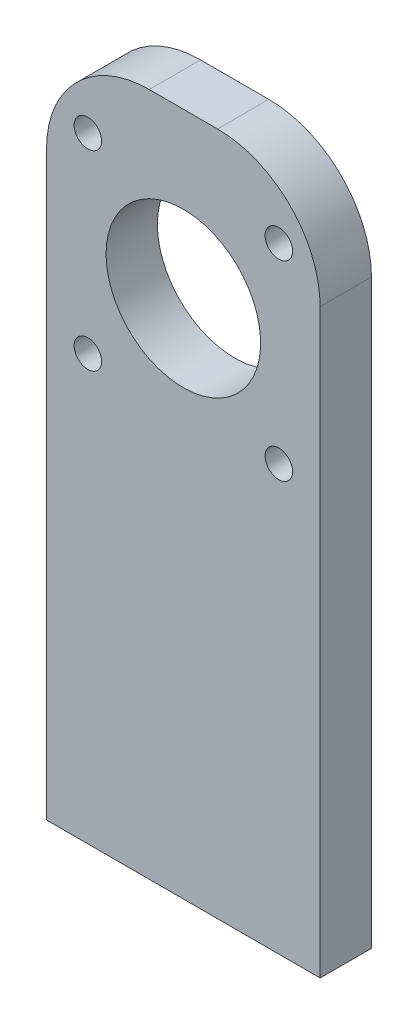
ISO-10303-21;
HEADER;
FILE_DESCRIPTION(('STEP AP214'),'2;1');
FILE_NAME('part.step','',(''),(''),'','','');
FILE_SCHEMA(('AUTOMOTIVE_DESIGN { 1 0 10303 214 1 1 1 1 }'));
ENDSEC;
DATA;
#1=APPLICATION_CONTEXT('core data for automotive mechanical design processes');
#2=APPLICATION_PROTOCOL_DEFINITION('international standard','automotive_design',2000,#1);
#3=PRODUCT_CONTEXT('',#1,'mechanical');
#4=PRODUCT('Part','Part','',(#3));
#5=PRODUCT_RELATED_PRODUCT_CATEGORY('part','',(#4));
#6=PRODUCT_DEFINITION_FORMATION('','',#4);
#7=PRODUCT_DEFINITION_CONTEXT('part definition',#1,'design');
#8=PRODUCT_DEFINITION('design','',#6,#7);
#9=PRODUCT_DEFINITION_SHAPE('','',#8);
#10=(LENGTH_UNIT() NAMED_UNIT(*) SI_UNIT(.MILLI.,.METRE.));
#11=(NAMED_UNIT(*) PLANE_ANGLE_UNIT() SI_UNIT($,.RADIAN.));
#12=(NAMED_UNIT(*) SI_UNIT($,.STERADIAN.) SOLID_ANGLE_UNIT());
#13=UNCERTAINTY_MEASURE_WITH_UNIT(LENGTH_MEASURE(1.E-05),#10,'distance_accuracy_value','');
#14=(GEOMETRIC_REPRESENTATION_CONTEXT(3) GLOBAL_UNCERTAINTY_ASSIGNED_CONTEXT((#13)) GLOBAL_UNIT_ASSIGNED_CONTEXT((#10,
#11,#12)) REPRESENTATION_CONTEXT('',''));
#15=CARTESIAN_POINT('',(0.,0.,0.));
#16=DIRECTION('',(0.,0.,1.));
#17=DIRECTION('',(1.,0.,0.));
#18=AXIS2_PLACEMENT_3D('',#15,#16,#17);
#19=CARTESIAN_POINT('',(0.,0.,9.525));
#20=DIRECTION('',(0.,0.,-1.));
#21=DIRECTION('',(-1.,0.,0.));
#22=AXIS2_PLACEMENT_3D('',#19,#20,#21);
#23=PLANE('',#22);
#24=DIRECTION('',(-1.,0.,0.));
#25=VECTOR('',#24,1.);
#26=CARTESIAN_POINT('',(0.,127.,9.525));
#27=LINE('',#26,#25);
#28=CARTESIAN_POINT('',(31.75,127.,9.525));
#29=VERTEX_POINT('',#28);
#30=CARTESIAN_POINT('',(19.05,127.,9.525));
#31=VERTEX_POINT('',#30);
#32=EDGE_CURVE('E127',#29,#31,#27,.T.);
#33=ORIENTED_EDGE('',*,*,#32,.T.);
#34=CARTESIAN_POINT('',(19.05,107.95,9.525));
#35=DIRECTION('',(0.,0.,-1.));
#36=DIRECTION('',(-1.,0.,0.));
#37=AXIS2_PLACEMENT_3D('',#34,#35,#36);
#38=CIRCLE('',#37,19.05);
#39=CARTESIAN_POINT('',(0.,107.95,9.525));
#40=VERTEX_POINT('',#39);
#41=EDGE_CURVE('E11',#31,#40,#38,.F.);
#42=ORIENTED_EDGE('',*,*,#41,.T.);
#43=DIRECTION('',(0.,-1.,0.));
#44=VECTOR('',#43,1.);
#45=CARTESIAN_POINT('',(0.,0.,9.525));
#46=LINE('',#45,#44);
#47=CARTESIAN_POINT('',(0.,0.,9.525));
#48=VERTEX_POINT('',#47);
#49=EDGE_CURVE('E92',#40,#48,#46,.T.);
#50=ORIENTED_EDGE('',*,*,#49,.T.);
#51=DIRECTION('',(1.,0.,0.));
#52=VECTOR('',#51,1.);
#53=CARTESIAN_POINT('',(0.,0.,9.525));
#54=LINE('',#53,#52);
#55=CARTESIAN_POINT('',(50.8,0.,9.525));
#56=VERTEX_POINT('',#55);
#57=EDGE_CURVE('E96',#48,#56,#54,.T.);
#58=ORIENTED_EDGE('',*,*,#57,.T.);
#59=DIRECTION('',(0.,1.,0.));
#60=VECTOR('',#59,1.);
#61=CARTESIAN_POINT('',(50.8,0.,9.525));
#62=LINE('',#61,#60);
#63=CARTESIAN_POINT('',(50.8,107.95,9.525));
#64=VERTEX_POINT('',#63);
#65=EDGE_CURVE('E114',#56,#64,#62,.T.);
#66=ORIENTED_EDGE('',*,*,#65,.T.);
#67=CARTESIAN_POINT('',(31.75,107.95,9.525));
#68=DIRECTION('',(0.,0.,-1.));
#69=DIRECTION('',(-1.,0.,0.));
#70=AXIS2_PLACEMENT_3D('',#67,#68,#69);
#71=CIRCLE('',#70,19.05);
#72=EDGE_CURVE('E136',#64,#29,#71,.F.);
#73=ORIENTED_EDGE('',*,*,#72,.T.);
#74=EDGE_LOOP('',(#33,#42,#50,#58,#66,#73));
#75=FACE_BOUND('',#74,.T.);
#76=CARTESIAN_POINT('',(43.1292,114.3,9.525));
#77=DIRECTION('',(0.,0.,1.));
#78=DIRECTION('',(1.,0.,0.));
#79=AXIS2_PLACEMENT_3D('',#76,#77,#78);
#80=CIRCLE('',#79,2.5527);
#81=CARTESIAN_POINT('',(40.5765,114.3,9.525));
#82=VERTEX_POINT('',#81);
#83=EDGE_CURVE('E150',#82,#82,#80,.T.);
#84=ORIENTED_EDGE('',*,*,#83,.F.);
#85=EDGE_LOOP('',(#84));
#86=FACE_BOUND('',#85,.T.);
#87=CARTESIAN_POINT('',(25.4,96.5708,9.525));
#88=DIRECTION('',(0.,0.,1.));
#89=DIRECTION('',(1.,0.,0.));
#90=AXIS2_PLACEMENT_3D('',#87,#88,#89);
#91=CIRCLE('',#90,14.351);
#92=CARTESIAN_POINT('',(11.049,96.5708,9.525));
#93=VERTEX_POINT('',#92);
#94=EDGE_CURVE('E314',#93,#93,#91,.T.);
#95=ORIENTED_EDGE('',*,*,#94,.F.);
#96=EDGE_LOOP('',(#95));
#97=FACE_BOUND('',#96,.T.);
#98=CARTESIAN_POINT('',(7.67079999999998,114.3,9.525));
#99=DIRECTION('',(0.,0.,1.));
#100=DIRECTION('',(1.,0.,0.));
#101=AXIS2_PLACEMENT_3D('',#98,#99,#100);
#102=CIRCLE('',#101,2.5527);
#103=CARTESIAN_POINT('',(5.11809999999998,114.3,9.525));
#104=VERTEX_POINT('',#103);
#105=EDGE_CURVE('E306',#104,#104,#102,.T.);
#106=ORIENTED_EDGE('',*,*,#105,.F.);
#107=EDGE_LOOP('',(#106));
#108=FACE_BOUND('',#107,.T.);
#109=CARTESIAN_POINT('',(7.67079999999998,78.8416,9.525));
#110=DIRECTION('',(0.,0.,1.));
#111=DIRECTION('',(1.,0.,0.));
#112=AXIS2_PLACEMENT_3D('',#109,#110,#111);
#113=CIRCLE('',#112,2.5527);
#114=CARTESIAN_POINT('',(5.11809999999998,78.8416,9.525));
#115=VERTEX_POINT('',#114);
#116=EDGE_CURVE('E298',#115,#115,#113,.T.);
#117=ORIENTED_EDGE('',*,*,#116,.F.);
#118=EDGE_LOOP('',(#117));
#119=FACE_BOUND('',#118,.T.);
#120=CARTESIAN_POINT('',(43.1292,78.8416,9.525));
#121=DIRECTION('',(0.,0.,1.));
#122=DIRECTION('',(1.,0.,0.));
#123=AXIS2_PLACEMENT_3D('',#120,#121,#122);
#124=CIRCLE('',#123,2.5527);
#125=CARTESIAN_POINT('',(40.5765,78.8416,9.525));
#126=VERTEX_POINT('',#125);
#127=EDGE_CURVE('E287',#126,#126,#124,.T.);
#128=ORIENTED_EDGE('',*,*,#127,.F.);
#129=EDGE_LOOP('',(#128));
#130=FACE_BOUND('',#129,.T.);
#131=ADVANCED_FACE('F39',(#75,#86,#97,#108,#119,#130),#23,.F.);
#132=CARTESIAN_POINT('',(0.,0.,0.));
#133=DIRECTION('',(0.,0.,-1.));
#134=DIRECTION('',(-1.,0.,0.));
#135=AXIS2_PLACEMENT_3D('',#132,#133,#134);
#136=PLANE('',#135);
#137=CARTESIAN_POINT('',(7.67079999999998,78.8416,0.));
#138=DIRECTION('',(0.,0.,1.));
#139=DIRECTION('',(1.,0.,0.));
#140=AXIS2_PLACEMENT_3D('',#137,#138,#139);
#141=CIRCLE('',#140,2.5527);
#142=CARTESIAN_POINT('',(5.11809999999998,78.8416,0.));
#143=VERTEX_POINT('',#142);
#144=EDGE_CURVE('E295',#143,#143,#141,.T.);
#145=ORIENTED_EDGE('',*,*,#144,.T.);
#146=EDGE_LOOP('',(#145));
#147=FACE_BOUND('',#146,.T.);
#148=CARTESIAN_POINT('',(25.4,96.5708,0.));
#149=DIRECTION('',(0.,0.,1.));
#150=DIRECTION('',(1.,0.,0.));
#151=AXIS2_PLACEMENT_3D('',#148,#149,#150);
#152=CIRCLE('',#151,14.351);
#153=CARTESIAN_POINT('',(11.049,96.5708,0.));
#154=VERTEX_POINT('',#153);
#155=EDGE_CURVE('E310',#154,#154,#152,.T.);
#156=ORIENTED_EDGE('',*,*,#155,.T.);
#157=EDGE_LOOP('',(#156));
#158=FACE_BOUND('',#157,.T.);
#159=DIRECTION('',(0.,-1.,0.));
#160=VECTOR('',#159,1.);
#161=CARTESIAN_POINT('',(0.,0.,0.));
#162=LINE('',#161,#160);
#163=CARTESIAN_POINT('',(0.,107.95,0.));
#164=VERTEX_POINT('',#163);
#165=CARTESIAN_POINT('',(0.,0.,0.));
#166=VERTEX_POINT('',#165);
#167=EDGE_CURVE('E117',#164,#166,#162,.T.);
#168=ORIENTED_EDGE('',*,*,#167,.F.);
#169=CARTESIAN_POINT('',(19.05,107.95,0.));
#170=DIRECTION('',(0.,0.,-1.));
#171=DIRECTION('',(-1.,0.,0.));
#172=AXIS2_PLACEMENT_3D('',#169,#170,#171);
#173=CIRCLE('',#172,19.05);
#174=CARTESIAN_POINT('',(19.05,127.,0.));
#175=VERTEX_POINT('',#174);
#176=EDGE_CURVE('E62',#164,#175,#173,.T.);
#177=ORIENTED_EDGE('',*,*,#176,.T.);
#178=DIRECTION('',(-1.,0.,0.));
#179=VECTOR('',#178,1.);
#180=CARTESIAN_POINT('',(0.,127.,0.));
#181=LINE('',#180,#179);
#182=CARTESIAN_POINT('',(31.75,127.,0.));
#183=VERTEX_POINT('',#182);
#184=EDGE_CURVE('E104',#183,#175,#181,.T.);
#185=ORIENTED_EDGE('',*,*,#184,.F.);
#186=CARTESIAN_POINT('',(31.75,107.95,0.));
#187=DIRECTION('',(0.,0.,-1.));
#188=DIRECTION('',(-1.,0.,0.));
#189=AXIS2_PLACEMENT_3D('',#186,#187,#188);
#190=CIRCLE('',#189,19.05);
#191=CARTESIAN_POINT('',(50.8,107.95,0.));
#192=VERTEX_POINT('',#191);
#193=EDGE_CURVE('E125',#183,#192,#190,.T.);
#194=ORIENTED_EDGE('',*,*,#193,.T.);
#195=DIRECTION('',(0.,1.,0.));
#196=VECTOR('',#195,1.);
#197=CARTESIAN_POINT('',(50.8,0.,0.));
#198=LINE('',#197,#196);
#199=CARTESIAN_POINT('',(50.8,0.,0.));
#200=VERTEX_POINT('',#199);
#201=EDGE_CURVE('E154',#200,#192,#198,.T.);
#202=ORIENTED_EDGE('',*,*,#201,.F.);
#203=DIRECTION('',(1.,0.,0.));
#204=VECTOR('',#203,1.);
#205=CARTESIAN_POINT('',(0.,0.,0.));
#206=LINE('',#205,#204);
#207=EDGE_CURVE('E148',#166,#200,#206,.T.);
#208=ORIENTED_EDGE('',*,*,#207,.F.);
#209=EDGE_LOOP('',(#168,#177,#185,#194,#202,#208));
#210=FACE_BOUND('',#209,.T.);
#211=CARTESIAN_POINT('',(43.1292,114.3,0.));
#212=DIRECTION('',(0.,0.,1.));
#213=DIRECTION('',(1.,0.,0.));
#214=AXIS2_PLACEMENT_3D('',#211,#212,#213);
#215=CIRCLE('',#214,2.5527);
#216=CARTESIAN_POINT('',(40.5765,114.3,0.));
#217=VERTEX_POINT('',#216);
#218=EDGE_CURVE('E157',#217,#217,#215,.T.);
#219=ORIENTED_EDGE('',*,*,#218,.T.);
#220=EDGE_LOOP('',(#219));
#221=FACE_BOUND('',#220,.T.);
#222=CARTESIAN_POINT('',(7.67079999999998,114.3,0.));
#223=DIRECTION('',(0.,0.,1.));
#224=DIRECTION('',(1.,0.,0.));
#225=AXIS2_PLACEMENT_3D('',#222,#223,#224);
#226=CIRCLE('',#225,2.5527);
#227=CARTESIAN_POINT('',(5.11809999999998,114.3,0.));
#228=VERTEX_POINT('',#227);
#229=EDGE_CURVE('E302',#228,#228,#226,.T.);
#230=ORIENTED_EDGE('',*,*,#229,.T.);
#231=EDGE_LOOP('',(#230));
#232=FACE_BOUND('',#231,.T.);
#233=CARTESIAN_POINT('',(43.1292,78.8416,0.));
#234=DIRECTION('',(0.,0.,1.));
#235=DIRECTION('',(1.,0.,0.));
#236=AXIS2_PLACEMENT_3D('',#233,#234,#235);
#237=CIRCLE('',#236,2.5527);
#238=CARTESIAN_POINT('',(40.5765,78.8416,0.));
#239=VERTEX_POINT('',#238);
#240=EDGE_CURVE('E290',#239,#239,#237,.T.);
#241=ORIENTED_EDGE('',*,*,#240,.T.);
#242=EDGE_LOOP('',(#241));
#243=FACE_BOUND('',#242,.T.);
#244=ADVANCED_FACE('F145',(#147,#158,#210,#221,#232,#243),#136,.T.);
#245=CARTESIAN_POINT('',(0.,0.,9.525));
#246=DIRECTION('',(1.,0.,0.));
#247=DIRECTION('',(0.,1.,0.));
#248=AXIS2_PLACEMENT_3D('',#245,#246,#247);
#249=PLANE('',#248);
#250=ORIENTED_EDGE('',*,*,#49,.F.);
#251=DIRECTION('',(0.,0.,-1.));
#252=VECTOR('',#251,1.);
#253=CARTESIAN_POINT('',(0.,107.95,9.525));
#254=LINE('',#253,#252);
#255=EDGE_CURVE('E139',#40,#164,#254,.T.);
#256=ORIENTED_EDGE('',*,*,#255,.T.);
#257=ORIENTED_EDGE('',*,*,#167,.T.);
#258=DIRECTION('',(0.,0.,-1.));
#259=VECTOR('',#258,1.);
#260=CARTESIAN_POINT('',(0.,0.,9.525));
#261=LINE('',#260,#259);
#262=EDGE_CURVE('E109',#48,#166,#261,.T.);
#263=ORIENTED_EDGE('',*,*,#262,.F.);
#264=EDGE_LOOP('',(#250,#256,#257,#263));
#265=FACE_BOUND('',#264,.T.);
#266=ADVANCED_FACE('F116',(#265),#249,.F.);
#267=CARTESIAN_POINT('',(0.,0.,9.525));
#268=DIRECTION('',(0.,1.,0.));
#269=DIRECTION('',(0.,0.,1.));
#270=AXIS2_PLACEMENT_3D('',#267,#268,#269);
#271=PLANE('',#270);
#272=ORIENTED_EDGE('',*,*,#207,.T.);
#273=DIRECTION('',(0.,0.,-1.));
#274=VECTOR('',#273,1.);
#275=CARTESIAN_POINT('',(50.8,0.,9.525));
#276=LINE('',#275,#274);
#277=EDGE_CURVE('E111',#56,#200,#276,.T.);
#278=ORIENTED_EDGE('',*,*,#277,.F.);
#279=ORIENTED_EDGE('',*,*,#57,.F.);
#280=ORIENTED_EDGE('',*,*,#262,.T.);
#281=EDGE_LOOP('',(#272,#278,#279,#280));
#282=FACE_BOUND('',#281,.T.);
#283=ADVANCED_FACE('F108',(#282),#271,.F.);
#284=CARTESIAN_POINT('',(50.8,0.,9.525));
#285=DIRECTION('',(-1.,0.,0.));
#286=DIRECTION('',(0.,-1.,0.));
#287=AXIS2_PLACEMENT_3D('',#284,#285,#286);
#288=PLANE('',#287);
#289=ORIENTED_EDGE('',*,*,#201,.T.);
#290=DIRECTION('',(0.,0.,-1.));
#291=VECTOR('',#290,1.);
#292=CARTESIAN_POINT('',(50.8,107.95,9.525));
#293=LINE('',#292,#291);
#294=EDGE_CURVE('E133',#192,#64,#293,.F.);
#295=ORIENTED_EDGE('',*,*,#294,.T.);
#296=ORIENTED_EDGE('',*,*,#65,.F.);
#297=ORIENTED_EDGE('',*,*,#277,.T.);
#298=EDGE_LOOP('',(#289,#295,#296,#297));
#299=FACE_BOUND('',#298,.T.);
#300=ADVANCED_FACE('F187',(#299),#288,.F.);
#301=CARTESIAN_POINT('',(0.,127.,9.525));
#302=DIRECTION('',(0.,-1.,0.));
#303=DIRECTION('',(0.,0.,-1.));
#304=AXIS2_PLACEMENT_3D('',#301,#302,#303);
#305=PLANE('',#304);
#306=ORIENTED_EDGE('',*,*,#184,.T.);
#307=DIRECTION('',(0.,0.,-1.));
#308=VECTOR('',#307,1.);
#309=CARTESIAN_POINT('',(19.05,127.,9.525));
#310=LINE('',#309,#308);
#311=EDGE_CURVE('E48',#175,#31,#310,.F.);
#312=ORIENTED_EDGE('',*,*,#311,.T.);
#313=ORIENTED_EDGE('',*,*,#32,.F.);
#314=DIRECTION('',(0.,0.,-1.));
#315=VECTOR('',#314,1.);
#316=CARTESIAN_POINT('',(31.75,127.,9.525));
#317=LINE('',#316,#315);
#318=EDGE_CURVE('E120',#29,#183,#317,.T.);
#319=ORIENTED_EDGE('',*,*,#318,.T.);
#320=EDGE_LOOP('',(#306,#312,#313,#319));
#321=FACE_BOUND('',#320,.T.);
#322=ADVANCED_FACE('F165',(#321),#305,.F.);
#323=CARTESIAN_POINT('',(43.1292,114.3,9.525));
#324=DIRECTION('',(0.,0.,-1.));
#325=DIRECTION('',(-1.,0.,0.));
#326=AXIS2_PLACEMENT_3D('',#323,#324,#325);
#327=CYLINDRICAL_SURFACE('',#326,2.5527);
#328=CARTESIAN_POINT('',(40.5765,114.3,9.525));
#329=CARTESIAN_POINT('',(40.5765,114.3,9.42578125));
#330=CARTESIAN_POINT('',(40.5765,114.3,9.3265625));
#331=CARTESIAN_POINT('',(40.5765,114.3,9.128125));
#332=CARTESIAN_POINT('',(40.5765,114.3,9.02890625));
#333=CARTESIAN_POINT('',(40.5765,114.3,8.83046875));
#334=CARTESIAN_POINT('',(40.5765,114.3,8.73125));
#335=CARTESIAN_POINT('',(40.5765,114.3,8.5328125));
#336=CARTESIAN_POINT('',(40.5765,114.3,8.43359375));
#337=CARTESIAN_POINT('',(40.5765,114.3,8.23515625));
#338=CARTESIAN_POINT('',(40.5765,114.3,8.1359375));
#339=CARTESIAN_POINT('',(40.5765,114.3,7.9375));
#340=CARTESIAN_POINT('',(40.5765,114.3,7.83828125));
#341=CARTESIAN_POINT('',(40.5765,114.3,7.63984375));
#342=CARTESIAN_POINT('',(40.5765,114.3,7.540625));
#343=CARTESIAN_POINT('',(40.5765,114.3,7.3421875));
#344=CARTESIAN_POINT('',(40.5765,114.3,7.24296875));
#345=CARTESIAN_POINT('',(40.5765,114.3,7.04453125));
#346=CARTESIAN_POINT('',(40.5765,114.3,6.9453125));
#347=CARTESIAN_POINT('',(40.5765,114.3,6.746875));
#348=CARTESIAN_POINT('',(40.5765,114.3,6.64765625));
#349=CARTESIAN_POINT('',(40.5765,114.3,6.44921875));
#350=CARTESIAN_POINT('',(40.5765,114.3,6.35));
#351=CARTESIAN_POINT('',(40.5765,114.3,6.1515625));
#352=CARTESIAN_POINT('',(40.5765,114.3,6.05234375));
#353=CARTESIAN_POINT('',(40.5765,114.3,5.85390625));
#354=CARTESIAN_POINT('',(40.5765,114.3,5.7546875));
#355=CARTESIAN_POINT('',(40.5765,114.3,5.55625));
#356=CARTESIAN_POINT('',(40.5765,114.3,5.45703125));
#357=CARTESIAN_POINT('',(40.5765,114.3,5.25859375));
#358=CARTESIAN_POINT('',(40.5765,114.3,5.159375));
#359=CARTESIAN_POINT('',(40.5765,114.3,4.9609375));
#360=CARTESIAN_POINT('',(40.5765,114.3,4.86171875));
#361=CARTESIAN_POINT('',(40.5765,114.3,4.66328125));
#362=CARTESIAN_POINT('',(40.5765,114.3,4.5640625));
#363=CARTESIAN_POINT('',(40.5765,114.3,4.365625));
#364=CARTESIAN_POINT('',(40.5765,114.3,4.26640625));
#365=CARTESIAN_POINT('',(40.5765,114.3,4.06796875));
#366=CARTESIAN_POINT('',(40.5765,114.3,3.96875));
#367=CARTESIAN_POINT('',(40.5765,114.3,3.7703125));
#368=CARTESIAN_POINT('',(40.5765,114.3,3.67109375));
#369=CARTESIAN_POINT('',(40.5765,114.3,3.47265625));
#370=CARTESIAN_POINT('',(40.5765,114.3,3.3734375));
#371=CARTESIAN_POINT('',(40.5765,114.3,3.175));
#372=CARTESIAN_POINT('',(40.5765,114.3,3.07578125));
#373=CARTESIAN_POINT('',(40.5765,114.3,2.87734375));
#374=CARTESIAN_POINT('',(40.5765,114.3,2.778125));
#375=CARTESIAN_POINT('',(40.5765,114.3,2.5796875));
#376=CARTESIAN_POINT('',(40.5765,114.3,2.48046875));
#377=CARTESIAN_POINT('',(40.5765,114.3,2.28203125));
#378=CARTESIAN_POINT('',(40.5765,114.3,2.1828125));
#379=CARTESIAN_POINT('',(40.5765,114.3,1.984375));
#380=CARTESIAN_POINT('',(40.5765,114.3,1.88515625));
#381=CARTESIAN_POINT('',(40.5765,114.3,1.68671875));
#382=CARTESIAN_POINT('',(40.5765,114.3,1.5875));
#383=CARTESIAN_POINT('',(40.5765,114.3,1.3890625));
#384=CARTESIAN_POINT('',(40.5765,114.3,1.28984375));
#385=CARTESIAN_POINT('',(40.5765,114.3,1.09140625));
#386=CARTESIAN_POINT('',(40.5765,114.3,0.992187500000001));
#387=CARTESIAN_POINT('',(40.5765,114.3,0.793750000000001));
#388=CARTESIAN_POINT('',(40.5765,114.3,0.69453125));
#389=CARTESIAN_POINT('',(40.5765,114.3,0.49609375));
#390=CARTESIAN_POINT('',(40.5765,114.3,0.396875));
#391=CARTESIAN_POINT('',(40.5765,114.3,0.1984375));
#392=CARTESIAN_POINT('',(40.5765,114.3,0.0992187500000001));
#393=CARTESIAN_POINT('',(40.5765,114.3,0.));
#394=B_SPLINE_CURVE_WITH_KNOTS('',3,(#328,#329,#330,#331,#332,#333,#334,#335,#336,#337,#338,
#339,#340,#341,#342,#343,#344,#345,#346,#347,#348,#349,#350,#351,#352,#353,#354,#355,#356,#357,
#358,#359,#360,#361,#362,#363,#364,#365,#366,#367,#368,#369,#370,#371,#372,#373,#374,#375,#376,
#377,#378,#379,#380,#381,#382,#383,#384,#385,#386,#387,#388,#389,#390,#391,#392,#393),
.UNSPECIFIED.,.F.,.F.,(4,2,2,2,2,2,2,2,2,2,2,2,2,2,2,2,2,2,2,2,2,2,2,2,2,2,2,2,2,2,2,2,4),(0.,
0.29765625,0.5953125,0.892968750000001,1.190625,1.48828125,1.7859375,2.08359375,2.38125,
2.67890625,2.9765625,3.27421875,3.571875,3.86953125,4.1671875,4.46484375,4.7625,5.06015625,
5.3578125,5.65546875,5.953125,6.25078125,6.5484375,6.84609375,7.14375,7.44140625,7.7390625,
8.03671875,8.334375,8.63203125,8.9296875,9.22734375,9.525),.UNSPECIFIED.);
#395=EDGE_CURVE('BSEAM182',#82,#217,#394,.T.);
#396=ORIENTED_EDGE('',*,*,#83,.T.);
#397=ORIENTED_EDGE('',*,*,#218,.F.);
#398=ORIENTED_EDGE('',*,*,#395,.T.);
#399=ORIENTED_EDGE('',*,*,#395,.F.);
#400=EDGE_LOOP('',(#396,#398,#397,#399));
#401=FACE_BOUND('',#400,.T.);
#402=ADVANCED_FACE('F182',(#401),#327,.F.);
#403=CARTESIAN_POINT('',(25.4,96.5708,9.525));
#404=DIRECTION('',(0.,0.,-1.));
#405=DIRECTION('',(-1.,0.,0.));
#406=AXIS2_PLACEMENT_3D('',#403,#404,#405);
#407=CYLINDRICAL_SURFACE('',#406,14.351);
#408=CARTESIAN_POINT('',(11.049,96.5708,9.525));
#409=CARTESIAN_POINT('',(11.049,96.5708,9.42578125));
#410=CARTESIAN_POINT('',(11.049,96.5708,9.3265625));
#411=CARTESIAN_POINT('',(11.049,96.5708,9.128125));
#412=CARTESIAN_POINT('',(11.049,96.5708,9.02890625));
#413=CARTESIAN_POINT('',(11.049,96.5708,8.83046875));
#414=CARTESIAN_POINT('',(11.049,96.5708,8.73125));
#415=CARTESIAN_POINT('',(11.049,96.5708,8.5328125));
#416=CARTESIAN_POINT('',(11.049,96.5708,8.43359375));
#417=CARTESIAN_POINT('',(11.049,96.5708,8.23515625));
#418=CARTESIAN_POINT('',(11.049,96.5708,8.1359375));
#419=CARTESIAN_POINT('',(11.049,96.5708,7.9375));
#420=CARTESIAN_POINT('',(11.049,96.5708,7.83828125));
#421=CARTESIAN_POINT('',(11.049,96.5708,7.63984375));
#422=CARTESIAN_POINT('',(11.049,96.5708,7.540625));
#423=CARTESIAN_POINT('',(11.049,96.5708,7.3421875));
#424=CARTESIAN_POINT('',(11.049,96.5708,7.24296875));
#425=CARTESIAN_POINT('',(11.049,96.5708,7.04453125));
#426=CARTESIAN_POINT('',(11.049,96.5708,6.9453125));
#427=CARTESIAN_POINT('',(11.049,96.5708,6.746875));
#428=CARTESIAN_POINT('',(11.049,96.5708,6.64765625));
#429=CARTESIAN_POINT('',(11.049,96.5708,6.44921875));
#430=CARTESIAN_POINT('',(11.049,96.5708,6.35));
#431=CARTESIAN_POINT('',(11.049,96.5708,6.1515625));
#432=CARTESIAN_POINT('',(11.049,96.5708,6.05234375));
#433=CARTESIAN_POINT('',(11.049,96.5708,5.85390625));
#434=CARTESIAN_POINT('',(11.049,96.5708,5.7546875));
#435=CARTESIAN_POINT('',(11.049,96.5708,5.55625));
#436=CARTESIAN_POINT('',(11.049,96.5708,5.45703125));
#437=CARTESIAN_POINT('',(11.049,96.5708,5.25859375));
#438=CARTESIAN_POINT('',(11.049,96.5708,5.159375));
#439=CARTESIAN_POINT('',(11.049,96.5708,4.9609375));
#440=CARTESIAN_POINT('',(11.049,96.5708,4.86171875));
#441=CARTESIAN_POINT('',(11.049,96.5708,4.66328125));
#442=CARTESIAN_POINT('',(11.049,96.5708,4.5640625));
#443=CARTESIAN_POINT('',(11.049,96.5708,4.365625));
#444=CARTESIAN_POINT('',(11.049,96.5708,4.26640625));
#445=CARTESIAN_POINT('',(11.049,96.5708,4.06796875));
#446=CARTESIAN_POINT('',(11.049,96.5708,3.96875));
#447=CARTESIAN_POINT('',(11.049,96.5708,3.7703125));
#448=CARTESIAN_POINT('',(11.049,96.5708,3.67109375));
#449=CARTESIAN_POINT('',(11.049,96.5708,3.47265625));
#450=CARTESIAN_POINT('',(11.049,96.5708,3.3734375));
#451=CARTESIAN_POINT('',(11.049,96.5708,3.175));
#452=CARTESIAN_POINT('',(11.049,96.5708,3.07578125));
#453=CARTESIAN_POINT('',(11.049,96.5708,2.87734375));
#454=CARTESIAN_POINT('',(11.049,96.5708,2.778125));
#455=CARTESIAN_POINT('',(11.049,96.5708,2.5796875));
#456=CARTESIAN_POINT('',(11.049,96.5708,2.48046875));
#457=CARTESIAN_POINT('',(11.049,96.5708,2.28203125));
#458=CARTESIAN_POINT('',(11.049,96.5708,2.1828125));
#459=CARTESIAN_POINT('',(11.049,96.5708,1.984375));
#460=CARTESIAN_POINT('',(11.049,96.5708,1.88515625));
#461=CARTESIAN_POINT('',(11.049,96.5708,1.68671875));
#462=CARTESIAN_POINT('',(11.049,96.5708,1.5875));
#463=CARTESIAN_POINT('',(11.049,96.5708,1.3890625));
#464=CARTESIAN_POINT('',(11.049,96.5708,1.28984375));
#465=CARTESIAN_POINT('',(11.049,96.5708,1.09140625));
#466=CARTESIAN_POINT('',(11.049,96.5708,0.992187500000001));
#467=CARTESIAN_POINT('',(11.049,96.5708,0.793750000000001));
#468=CARTESIAN_POINT('',(11.049,96.5708,0.69453125));
#469=CARTESIAN_POINT('',(11.049,96.5708,0.49609375));
#470=CARTESIAN_POINT('',(11.049,96.5708,0.396875));
#471=CARTESIAN_POINT('',(11.049,96.5708,0.1984375));
#472=CARTESIAN_POINT('',(11.049,96.5708,0.0992187500000001));
#473=CARTESIAN_POINT('',(11.049,96.5708,0.));
#474=B_SPLINE_CURVE_WITH_KNOTS('',3,(#408,#409,#410,#411,#412,#413,#414,#415,#416,#417,#418,
#419,#420,#421,#422,#423,#424,#425,#426,#427,#428,#429,#430,#431,#432,#433,#434,#435,#436,#437,
#438,#439,#440,#441,#442,#443,#444,#445,#446,#447,#448,#449,#450,#451,#452,#453,#454,#455,#456,
#457,#458,#459,#460,#461,#462,#463,#464,#465,#466,#467,#468,#469,#470,#471,#472,#473),
.UNSPECIFIED.,.F.,.F.,(4,2,2,2,2,2,2,2,2,2,2,2,2,2,2,2,2,2,2,2,2,2,2,2,2,2,2,2,2,2,2,2,4),(0.,
0.29765625,0.5953125,0.892968750000001,1.190625,1.48828125,1.7859375,2.08359375,2.38125,
2.67890625,2.9765625,3.27421875,3.571875,3.86953125,4.1671875,4.46484375,4.7625,5.06015625,
5.3578125,5.65546875,5.953125,6.25078125,6.5484375,6.84609375,7.14375,7.44140625,7.7390625,
8.03671875,8.334375,8.63203125,8.9296875,9.22734375,9.525),.UNSPECIFIED.);
#475=EDGE_CURVE('BSEAM218',#93,#154,#474,.T.);
#476=ORIENTED_EDGE('',*,*,#94,.T.);
#477=ORIENTED_EDGE('',*,*,#155,.F.);
#478=ORIENTED_EDGE('',*,*,#475,.T.);
#479=ORIENTED_EDGE('',*,*,#475,.F.);
#480=EDGE_LOOP('',(#476,#478,#477,#479));
#481=FACE_BOUND('',#480,.T.);
#482=ADVANCED_FACE('F218',(#481),#407,.F.);
#483=CARTESIAN_POINT('',(7.67079999999998,114.3,9.525));
#484=DIRECTION('',(0.,0.,-1.));
#485=DIRECTION('',(-1.,0.,0.));
#486=AXIS2_PLACEMENT_3D('',#483,#484,#485);
#487=CYLINDRICAL_SURFACE('',#486,2.5527);
#488=CARTESIAN_POINT('',(5.11809999999998,114.3,9.525));
#489=CARTESIAN_POINT('',(5.11809999999998,114.3,9.42578125));
#490=CARTESIAN_POINT('',(5.11809999999998,114.3,9.3265625));
#491=CARTESIAN_POINT('',(5.11809999999998,114.3,9.128125));
#492=CARTESIAN_POINT('',(5.11809999999998,114.3,9.02890625));
#493=CARTESIAN_POINT('',(5.11809999999998,114.3,8.83046875));
#494=CARTESIAN_POINT('',(5.11809999999998,114.3,8.73125));
#495=CARTESIAN_POINT('',(5.11809999999998,114.3,8.5328125));
#496=CARTESIAN_POINT('',(5.11809999999998,114.3,8.43359375));
#497=CARTESIAN_POINT('',(5.11809999999998,114.3,8.23515625));
#498=CARTESIAN_POINT('',(5.11809999999998,114.3,8.1359375));
#499=CARTESIAN_POINT('',(5.11809999999998,114.3,7.9375));
#500=CARTESIAN_POINT('',(5.11809999999998,114.3,7.83828125));
#501=CARTESIAN_POINT('',(5.11809999999998,114.3,7.63984375));
#502=CARTESIAN_POINT('',(5.11809999999998,114.3,7.540625));
#503=CARTESIAN_POINT('',(5.11809999999998,114.3,7.3421875));
#504=CARTESIAN_POINT('',(5.11809999999998,114.3,7.24296875));
#505=CARTESIAN_POINT('',(5.11809999999998,114.3,7.04453125));
#506=CARTESIAN_POINT('',(5.11809999999998,114.3,6.9453125));
#507=CARTESIAN_POINT('',(5.11809999999998,114.3,6.746875));
#508=CARTESIAN_POINT('',(5.11809999999998,114.3,6.64765625));
#509=CARTESIAN_POINT('',(5.11809999999998,114.3,6.44921875));
#510=CARTESIAN_POINT('',(5.11809999999998,114.3,6.35));
#511=CARTESIAN_POINT('',(5.11809999999998,114.3,6.1515625));
#512=CARTESIAN_POINT('',(5.11809999999998,114.3,6.05234375));
#513=CARTESIAN_POINT('',(5.11809999999998,114.3,5.85390625));
#514=CARTESIAN_POINT('',(5.11809999999998,114.3,5.7546875));
#515=CARTESIAN_POINT('',(5.11809999999998,114.3,5.55625));
#516=CARTESIAN_POINT('',(5.11809999999998,114.3,5.45703125));
#517=CARTESIAN_POINT('',(5.11809999999998,114.3,5.25859375));
#518=CARTESIAN_POINT('',(5.11809999999998,114.3,5.159375));
#519=CARTESIAN_POINT('',(5.11809999999998,114.3,4.9609375));
#520=CARTESIAN_POINT('',(5.11809999999998,114.3,4.86171875));
#521=CARTESIAN_POINT('',(5.11809999999998,114.3,4.66328125));
#522=CARTESIAN_POINT('',(5.11809999999998,114.3,4.5640625));
#523=CARTESIAN_POINT('',(5.11809999999998,114.3,4.365625));
#524=CARTESIAN_POINT('',(5.11809999999998,114.3,4.26640625));
#525=CARTESIAN_POINT('',(5.11809999999998,114.3,4.06796875));
#526=CARTESIAN_POINT('',(5.11809999999998,114.3,3.96875));
#527=CARTESIAN_POINT('',(5.11809999999998,114.3,3.7703125));
#528=CARTESIAN_POINT('',(5.11809999999998,114.3,3.67109375));
#529=CARTESIAN_POINT('',(5.11809999999998,114.3,3.47265625));
#530=CARTESIAN_POINT('',(5.11809999999998,114.3,3.3734375));
#531=CARTESIAN_POINT('',(5.11809999999998,114.3,3.175));
#532=CARTESIAN_POINT('',(5.11809999999998,114.3,3.07578125));
#533=CARTESIAN_POINT('',(5.11809999999998,114.3,2.87734375));
#534=CARTESIAN_POINT('',(5.11809999999998,114.3,2.778125));
#535=CARTESIAN_POINT('',(5.11809999999998,114.3,2.5796875));
#536=CARTESIAN_POINT('',(5.11809999999998,114.3,2.48046875));
#537=CARTESIAN_POINT('',(5.11809999999998,114.3,2.28203125));
#538=CARTESIAN_POINT('',(5.11809999999998,114.3,2.1828125));
#539=CARTESIAN_POINT('',(5.11809999999998,114.3,1.984375));
#540=CARTESIAN_POINT('',(5.11809999999998,114.3,1.88515625));
#541=CARTESIAN_POINT('',(5.11809999999998,114.3,1.68671875));
#542=CARTESIAN_POINT('',(5.11809999999998,114.3,1.5875));
#543=CARTESIAN_POINT('',(5.11809999999998,114.3,1.3890625));
#544=CARTESIAN_POINT('',(5.11809999999998,114.3,1.28984375));
#545=CARTESIAN_POINT('',(5.11809999999998,114.3,1.09140625));
#546=CARTESIAN_POINT('',(5.11809999999998,114.3,0.992187500000001));
#547=CARTESIAN_POINT('',(5.11809999999998,114.3,0.793750000000001));
#548=CARTESIAN_POINT('',(5.11809999999998,114.3,0.69453125));
#549=CARTESIAN_POINT('',(5.11809999999998,114.3,0.49609375));
#550=CARTESIAN_POINT('',(5.11809999999998,114.3,0.396875));
#551=CARTESIAN_POINT('',(5.11809999999998,114.3,0.1984375));
#552=CARTESIAN_POINT('',(5.11809999999998,114.3,0.0992187500000001));
#553=CARTESIAN_POINT('',(5.11809999999998,114.3,0.));
#554=B_SPLINE_CURVE_WITH_KNOTS('',3,(#488,#489,#490,#491,#492,#493,#494,#495,#496,#497,#498,
#499,#500,#501,#502,#503,#504,#505,#506,#507,#508,#509,#510,#511,#512,#513,#514,#515,#516,#517,
#518,#519,#520,#521,#522,#523,#524,#525,#526,#527,#528,#529,#530,#531,#532,#533,#534,#535,#536,
#537,#538,#539,#540,#541,#542,#543,#544,#545,#546,#547,#548,#549,#550,#551,#552,#553),
.UNSPECIFIED.,.F.,.F.,(4,2,2,2,2,2,2,2,2,2,2,2,2,2,2,2,2,2,2,2,2,2,2,2,2,2,2,2,2,2,2,2,4),(0.,
0.29765625,0.5953125,0.892968750000001,1.190625,1.48828125,1.7859375,2.08359375,2.38125,
2.67890625,2.9765625,3.27421875,3.571875,3.86953125,4.1671875,4.46484375,4.7625,5.06015625,
5.3578125,5.65546875,5.953125,6.25078125,6.5484375,6.84609375,7.14375,7.44140625,7.7390625,
8.03671875,8.334375,8.63203125,8.9296875,9.22734375,9.525),.UNSPECIFIED.);
#555=EDGE_CURVE('BSEAM225',#104,#228,#554,.T.);
#556=ORIENTED_EDGE('',*,*,#105,.T.);
#557=ORIENTED_EDGE('',*,*,#229,.F.);
#558=ORIENTED_EDGE('',*,*,#555,.T.);
#559=ORIENTED_EDGE('',*,*,#555,.F.);
#560=EDGE_LOOP('',(#556,#558,#557,#559));
#561=FACE_BOUND('',#560,.T.);
#562=ADVANCED_FACE('F225',(#561),#487,.F.);
#563=CARTESIAN_POINT('',(7.67079999999998,78.8416,9.525));
#564=DIRECTION('',(0.,0.,-1.));
#565=DIRECTION('',(-1.,0.,0.));
#566=AXIS2_PLACEMENT_3D('',#563,#564,#565);
#567=CYLINDRICAL_SURFACE('',#566,2.5527);
#568=CARTESIAN_POINT('',(5.11809999999998,78.8416,9.525));
#569=CARTESIAN_POINT('',(5.11809999999998,78.8416,9.42578125));
#570=CARTESIAN_POINT('',(5.11809999999998,78.8416,9.3265625));
#571=CARTESIAN_POINT('',(5.11809999999998,78.8416,9.128125));
#572=CARTESIAN_POINT('',(5.11809999999998,78.8416,9.02890625));
#573=CARTESIAN_POINT('',(5.11809999999998,78.8416,8.83046875));
#574=CARTESIAN_POINT('',(5.11809999999998,78.8416,8.73125));
#575=CARTESIAN_POINT('',(5.11809999999998,78.8416,8.5328125));
#576=CARTESIAN_POINT('',(5.11809999999998,78.8416,8.43359375));
#577=CARTESIAN_POINT('',(5.11809999999998,78.8416,8.23515625));
#578=CARTESIAN_POINT('',(5.11809999999998,78.8416,8.1359375));
#579=CARTESIAN_POINT('',(5.11809999999998,78.8416,7.9375));
#580=CARTESIAN_POINT('',(5.11809999999998,78.8416,7.83828125));
#581=CARTESIAN_POINT('',(5.11809999999998,78.8416,7.63984375));
#582=CARTESIAN_POINT('',(5.11809999999998,78.8416,7.540625));
#583=CARTESIAN_POINT('',(5.11809999999998,78.8416,7.3421875));
#584=CARTESIAN_POINT('',(5.11809999999998,78.8416,7.24296875));
#585=CARTESIAN_POINT('',(5.11809999999998,78.8416,7.04453125));
#586=CARTESIAN_POINT('',(5.11809999999998,78.8416,6.9453125));
#587=CARTESIAN_POINT('',(5.11809999999998,78.8416,6.746875));
#588=CARTESIAN_POINT('',(5.11809999999998,78.8416,6.64765625));
#589=CARTESIAN_POINT('',(5.11809999999998,78.8416,6.44921875));
#590=CARTESIAN_POINT('',(5.11809999999998,78.8416,6.35));
#591=CARTESIAN_POINT('',(5.11809999999998,78.8416,6.1515625));
#592=CARTESIAN_POINT('',(5.11809999999998,78.8416,6.05234375));
#593=CARTESIAN_POINT('',(5.11809999999998,78.8416,5.85390625));
#594=CARTESIAN_POINT('',(5.11809999999998,78.8416,5.7546875));
#595=CARTESIAN_POINT('',(5.11809999999998,78.8416,5.55625));
#596=CARTESIAN_POINT('',(5.11809999999998,78.8416,5.45703125));
#597=CARTESIAN_POINT('',(5.11809999999998,78.8416,5.25859375));
#598=CARTESIAN_POINT('',(5.11809999999998,78.8416,5.159375));
#599=CARTESIAN_POINT('',(5.11809999999998,78.8416,4.9609375));
#600=CARTESIAN_POINT('',(5.11809999999998,78.8416,4.86171875));
#601=CARTESIAN_POINT('',(5.11809999999998,78.8416,4.66328125));
#602=CARTESIAN_POINT('',(5.11809999999998,78.8416,4.5640625));
#603=CARTESIAN_POINT('',(5.11809999999998,78.8416,4.365625));
#604=CARTESIAN_POINT('',(5.11809999999998,78.8416,4.26640625));
#605=CARTESIAN_POINT('',(5.11809999999998,78.8416,4.06796875));
#606=CARTESIAN_POINT('',(5.11809999999998,78.8416,3.96875));
#607=CARTESIAN_POINT('',(5.11809999999998,78.8416,3.7703125));
#608=CARTESIAN_POINT('',(5.11809999999998,78.8416,3.67109375));
#609=CARTESIAN_POINT('',(5.11809999999998,78.8416,3.47265625));
#610=CARTESIAN_POINT('',(5.11809999999998,78.8416,3.3734375));
#611=CARTESIAN_POINT('',(5.11809999999998,78.8416,3.175));
#612=CARTESIAN_POINT('',(5.11809999999998,78.8416,3.07578125));
#613=CARTESIAN_POINT('',(5.11809999999998,78.8416,2.87734375));
#614=CARTESIAN_POINT('',(5.11809999999998,78.8416,2.778125));
#615=CARTESIAN_POINT('',(5.11809999999998,78.8416,2.5796875));
#616=CARTESIAN_POINT('',(5.11809999999998,78.8416,2.48046875));
#617=CARTESIAN_POINT('',(5.11809999999998,78.8416,2.28203125));
#618=CARTESIAN_POINT('',(5.11809999999998,78.8416,2.1828125));
#619=CARTESIAN_POINT('',(5.11809999999998,78.8416,1.984375));
#620=CARTESIAN_POINT('',(5.11809999999998,78.8416,1.88515625));
#621=CARTESIAN_POINT('',(5.11809999999998,78.8416,1.68671875));
#622=CARTESIAN_POINT('',(5.11809999999998,78.8416,1.5875));
#623=CARTESIAN_POINT('',(5.11809999999998,78.8416,1.3890625));
#624=CARTESIAN_POINT('',(5.11809999999998,78.8416,1.28984375));
#625=CARTESIAN_POINT('',(5.11809999999998,78.8416,1.09140625));
#626=CARTESIAN_POINT('',(5.11809999999998,78.8416,0.992187500000001));
#627=CARTESIAN_POINT('',(5.11809999999998,78.8416,0.793750000000001));
#628=CARTESIAN_POINT('',(5.11809999999998,78.8416,0.69453125));
#629=CARTESIAN_POINT('',(5.11809999999998,78.8416,0.49609375));
#630=CARTESIAN_POINT('',(5.11809999999998,78.8416,0.396875));
#631=CARTESIAN_POINT('',(5.11809999999998,78.8416,0.1984375));
#632=CARTESIAN_POINT('',(5.11809999999998,78.8416,0.0992187500000001));
#633=CARTESIAN_POINT('',(5.11809999999998,78.8416,0.));
#634=B_SPLINE_CURVE_WITH_KNOTS('',3,(#568,#569,#570,#571,#572,#573,#574,#575,#576,#577,#578,
#579,#580,#581,#582,#583,#584,#585,#586,#587,#588,#589,#590,#591,#592,#593,#594,#595,#596,#597,
#598,#599,#600,#601,#602,#603,#604,#605,#606,#607,#608,#609,#610,#611,#612,#613,#614,#615,#616,
#617,#618,#619,#620,#621,#622,#623,#624,#625,#626,#627,#628,#629,#630,#631,#632,#633),
.UNSPECIFIED.,.F.,.F.,(4,2,2,2,2,2,2,2,2,2,2,2,2,2,2,2,2,2,2,2,2,2,2,2,2,2,2,2,2,2,2,2,4),(0.,
0.29765625,0.5953125,0.892968750000001,1.190625,1.48828125,1.7859375,2.08359375,2.38125,
2.67890625,2.9765625,3.27421875,3.571875,3.86953125,4.1671875,4.46484375,4.7625,5.06015625,
5.3578125,5.65546875,5.953125,6.25078125,6.5484375,6.84609375,7.14375,7.44140625,7.7390625,
8.03671875,8.334375,8.63203125,8.9296875,9.22734375,9.525),.UNSPECIFIED.);
#635=EDGE_CURVE('BSEAM232',#115,#143,#634,.T.);
#636=ORIENTED_EDGE('',*,*,#116,.T.);
#637=ORIENTED_EDGE('',*,*,#144,.F.);
#638=ORIENTED_EDGE('',*,*,#635,.T.);
#639=ORIENTED_EDGE('',*,*,#635,.F.);
#640=EDGE_LOOP('',(#636,#638,#637,#639));
#641=FACE_BOUND('',#640,.T.);
#642=ADVANCED_FACE('F232',(#641),#567,.F.);
#643=CARTESIAN_POINT('',(43.1292,78.8416,9.525));
#644=DIRECTION('',(0.,0.,-1.));
#645=DIRECTION('',(-1.,0.,0.));
#646=AXIS2_PLACEMENT_3D('',#643,#644,#645);
#647=CYLINDRICAL_SURFACE('',#646,2.5527);
#648=CARTESIAN_POINT('',(40.5765,78.8416,9.525));
#649=CARTESIAN_POINT('',(40.5765,78.8416,9.42578125));
#650=CARTESIAN_POINT('',(40.5765,78.8416,9.3265625));
#651=CARTESIAN_POINT('',(40.5765,78.8416,9.128125));
#652=CARTESIAN_POINT('',(40.5765,78.8416,9.02890625));
#653=CARTESIAN_POINT('',(40.5765,78.8416,8.83046875));
#654=CARTESIAN_POINT('',(40.5765,78.8416,8.73125));
#655=CARTESIAN_POINT('',(40.5765,78.8416,8.5328125));
#656=CARTESIAN_POINT('',(40.5765,78.8416,8.43359375));
#657=CARTESIAN_POINT('',(40.5765,78.8416,8.23515625));
#658=CARTESIAN_POINT('',(40.5765,78.8416,8.1359375));
#659=CARTESIAN_POINT('',(40.5765,78.8416,7.9375));
#660=CARTESIAN_POINT('',(40.5765,78.8416,7.83828125));
#661=CARTESIAN_POINT('',(40.5765,78.8416,7.63984375));
#662=CARTESIAN_POINT('',(40.5765,78.8416,7.540625));
#663=CARTESIAN_POINT('',(40.5765,78.8416,7.3421875));
#664=CARTESIAN_POINT('',(40.5765,78.8416,7.24296875));
#665=CARTESIAN_POINT('',(40.5765,78.8416,7.04453125));
#666=CARTESIAN_POINT('',(40.5765,78.8416,6.9453125));
#667=CARTESIAN_POINT('',(40.5765,78.8416,6.746875));
#668=CARTESIAN_POINT('',(40.5765,78.8416,6.64765625));
#669=CARTESIAN_POINT('',(40.5765,78.8416,6.44921875));
#670=CARTESIAN_POINT('',(40.5765,78.8416,6.35));
#671=CARTESIAN_POINT('',(40.5765,78.8416,6.1515625));
#672=CARTESIAN_POINT('',(40.5765,78.8416,6.05234375));
#673=CARTESIAN_POINT('',(40.5765,78.8416,5.85390625));
#674=CARTESIAN_POINT('',(40.5765,78.8416,5.7546875));
#675=CARTESIAN_POINT('',(40.5765,78.8416,5.55625));
#676=CARTESIAN_POINT('',(40.5765,78.8416,5.45703125));
#677=CARTESIAN_POINT('',(40.5765,78.8416,5.25859375));
#678=CARTESIAN_POINT('',(40.5765,78.8416,5.159375));
#679=CARTESIAN_POINT('',(40.5765,78.8416,4.9609375));
#680=CARTESIAN_POINT('',(40.5765,78.8416,4.86171875));
#681=CARTESIAN_POINT('',(40.5765,78.8416,4.66328125));
#682=CARTESIAN_POINT('',(40.5765,78.8416,4.5640625));
#683=CARTESIAN_POINT('',(40.5765,78.8416,4.365625));
#684=CARTESIAN_POINT('',(40.5765,78.8416,4.26640625));
#685=CARTESIAN_POINT('',(40.5765,78.8416,4.06796875));
#686=CARTESIAN_POINT('',(40.5765,78.8416,3.96875));
#687=CARTESIAN_POINT('',(40.5765,78.8416,3.7703125));
#688=CARTESIAN_POINT('',(40.5765,78.8416,3.67109375));
#689=CARTESIAN_POINT('',(40.5765,78.8416,3.47265625));
#690=CARTESIAN_POINT('',(40.5765,78.8416,3.3734375));
#691=CARTESIAN_POINT('',(40.5765,78.8416,3.175));
#692=CARTESIAN_POINT('',(40.5765,78.8416,3.07578125));
#693=CARTESIAN_POINT('',(40.5765,78.8416,2.87734375));
#694=CARTESIAN_POINT('',(40.5765,78.8416,2.778125));
#695=CARTESIAN_POINT('',(40.5765,78.8416,2.5796875));
#696=CARTESIAN_POINT('',(40.5765,78.8416,2.48046875));
#697=CARTESIAN_POINT('',(40.5765,78.8416,2.28203125));
#698=CARTESIAN_POINT('',(40.5765,78.8416,2.1828125));
#699=CARTESIAN_POINT('',(40.5765,78.8416,1.984375));
#700=CARTESIAN_POINT('',(40.5765,78.8416,1.88515625));
#701=CARTESIAN_POINT('',(40.5765,78.8416,1.68671875));
#702=CARTESIAN_POINT('',(40.5765,78.8416,1.5875));
#703=CARTESIAN_POINT('',(40.5765,78.8416,1.3890625));
#704=CARTESIAN_POINT('',(40.5765,78.8416,1.28984375));
#705=CARTESIAN_POINT('',(40.5765,78.8416,1.09140625));
#706=CARTESIAN_POINT('',(40.5765,78.8416,0.992187500000001));
#707=CARTESIAN_POINT('',(40.5765,78.8416,0.793750000000001));
#708=CARTESIAN_POINT('',(40.5765,78.8416,0.69453125));
#709=CARTESIAN_POINT('',(40.5765,78.8416,0.49609375));
#710=CARTESIAN_POINT('',(40.5765,78.8416,0.396875));
#711=CARTESIAN_POINT('',(40.5765,78.8416,0.1984375));
#712=CARTESIAN_POINT('',(40.5765,78.8416,0.0992187500000001));
#713=CARTESIAN_POINT('',(40.5765,78.8416,0.));
#714=B_SPLINE_CURVE_WITH_KNOTS('',3,(#648,#649,#650,#651,#652,#653,#654,#655,#656,#657,#658,
#659,#660,#661,#662,#663,#664,#665,#666,#667,#668,#669,#670,#671,#672,#673,#674,#675,#676,#677,
#678,#679,#680,#681,#682,#683,#684,#685,#686,#687,#688,#689,#690,#691,#692,#693,#694,#695,#696,
#697,#698,#699,#700,#701,#702,#703,#704,#705,#706,#707,#708,#709,#710,#711,#712,#713),
.UNSPECIFIED.,.F.,.F.,(4,2,2,2,2,2,2,2,2,2,2,2,2,2,2,2,2,2,2,2,2,2,2,2,2,2,2,2,2,2,2,2,4),(0.,
0.29765625,0.5953125,0.892968750000001,1.190625,1.48828125,1.7859375,2.08359375,2.38125,
2.67890625,2.9765625,3.27421875,3.571875,3.86953125,4.1671875,4.46484375,4.7625,5.06015625,
5.3578125,5.65546875,5.953125,6.25078125,6.5484375,6.84609375,7.14375,7.44140625,7.7390625,
8.03671875,8.334375,8.63203125,8.9296875,9.22734375,9.525),.UNSPECIFIED.);
#715=EDGE_CURVE('BSEAM172',#126,#239,#714,.T.);
#716=ORIENTED_EDGE('',*,*,#127,.T.);
#717=ORIENTED_EDGE('',*,*,#240,.F.);
#718=ORIENTED_EDGE('',*,*,#715,.T.);
#719=ORIENTED_EDGE('',*,*,#715,.F.);
#720=EDGE_LOOP('',(#716,#718,#717,#719));
#721=FACE_BOUND('',#720,.T.);
#722=ADVANCED_FACE('F172',(#721),#647,.F.);
#723=CARTESIAN_POINT('',(31.75,107.95,9.525));
#724=DIRECTION('',(0.,0.,-1.));
#725=DIRECTION('',(-1.,0.,0.));
#726=AXIS2_PLACEMENT_3D('',#723,#724,#725);
#727=CYLINDRICAL_SURFACE('',#726,19.05);
#728=ORIENTED_EDGE('',*,*,#72,.F.);
#729=ORIENTED_EDGE('',*,*,#294,.F.);
#730=ORIENTED_EDGE('',*,*,#193,.F.);
#731=ORIENTED_EDGE('',*,*,#318,.F.);
#732=EDGE_LOOP('',(#728,#729,#730,#731));
#733=FACE_BOUND('',#732,.T.);
#734=ADVANCED_FACE('F168',(#733),#727,.T.);
#735=CARTESIAN_POINT('',(19.05,107.95,9.525));
#736=DIRECTION('',(0.,0.,-1.));
#737=DIRECTION('',(-1.,0.,0.));
#738=AXIS2_PLACEMENT_3D('',#735,#736,#737);
#739=CYLINDRICAL_SURFACE('',#738,19.05);
#740=ORIENTED_EDGE('',*,*,#41,.F.);
#741=ORIENTED_EDGE('',*,*,#311,.F.);
#742=ORIENTED_EDGE('',*,*,#176,.F.);
#743=ORIENTED_EDGE('',*,*,#255,.F.);
#744=EDGE_LOOP('',(#740,#741,#742,#743));
#745=FACE_BOUND('',#744,.T.);
#746=ADVANCED_FACE('F41',(#745),#739,.T.);
#747=CLOSED_SHELL('',(#131,#244,#266,#283,#300,#322,#402,#482,#562,#642,#722,#734,#746));
#748=MANIFOLD_SOLID_BREP('B2',#747);
#749=ADVANCED_BREP_SHAPE_REPRESENTATION('',(#18,#748),#14);
#750=SHAPE_DEFINITION_REPRESENTATION(#9,#749);
ENDSEC;
END-ISO-10303-21;
